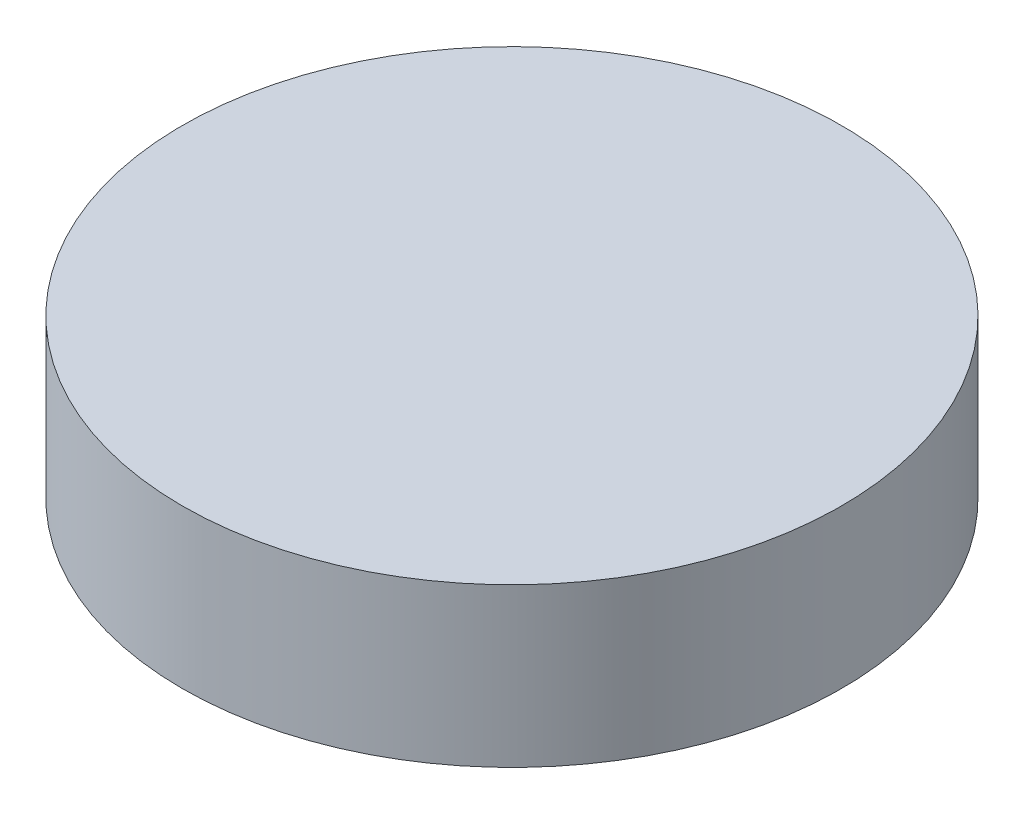
ISO-10303-21;
HEADER;
FILE_DESCRIPTION(('STEP AP214'),'2;1');
FILE_NAME('part.step','',(''),(''),'','','');
FILE_SCHEMA(('AUTOMOTIVE_DESIGN { 1 0 10303 214 1 1 1 1 }'));
ENDSEC;
DATA;
#1=APPLICATION_CONTEXT('core data for automotive mechanical design processes');
#2=APPLICATION_PROTOCOL_DEFINITION('international standard','automotive_design',2000,#1);
#3=PRODUCT_CONTEXT('',#1,'mechanical');
#4=PRODUCT('Part','Part','',(#3));
#5=PRODUCT_RELATED_PRODUCT_CATEGORY('part','',(#4));
#6=PRODUCT_DEFINITION_FORMATION('','',#4);
#7=PRODUCT_DEFINITION_CONTEXT('part definition',#1,'design');
#8=PRODUCT_DEFINITION('design','',#6,#7);
#9=PRODUCT_DEFINITION_SHAPE('','',#8);
#10=(LENGTH_UNIT() NAMED_UNIT(*) SI_UNIT(.MILLI.,.METRE.));
#11=(NAMED_UNIT(*) PLANE_ANGLE_UNIT() SI_UNIT($,.RADIAN.));
#12=(NAMED_UNIT(*) SI_UNIT($,.STERADIAN.) SOLID_ANGLE_UNIT());
#13=UNCERTAINTY_MEASURE_WITH_UNIT(LENGTH_MEASURE(1.E-05),#10,'distance_accuracy_value','');
#14=(GEOMETRIC_REPRESENTATION_CONTEXT(3) GLOBAL_UNCERTAINTY_ASSIGNED_CONTEXT((#13)) GLOBAL_UNIT_ASSIGNED_CONTEXT((#10,
#11,#12)) REPRESENTATION_CONTEXT('',''));
#15=CARTESIAN_POINT('',(0.,0.,0.));
#16=DIRECTION('',(0.,0.,1.));
#17=DIRECTION('',(1.,0.,0.));
#18=AXIS2_PLACEMENT_3D('',#15,#16,#17);
#19=CARTESIAN_POINT('',(650.,12.,-50.));
#20=DIRECTION('',(0.,-1.,0.));
#21=DIRECTION('',(0.,0.,-1.));
#22=AXIS2_PLACEMENT_3D('',#19,#20,#21);
#23=CYLINDRICAL_SURFACE('',#22,25.);
#24=CARTESIAN_POINT('',(650.,12.,-50.));
#25=DIRECTION('',(0.,1.,0.));
#26=DIRECTION('',(0.,0.,1.));
#27=AXIS2_PLACEMENT_3D('',#24,#25,#26);
#28=CIRCLE('',#27,25.);
#29=CARTESIAN_POINT('',(650.,12.,-25.));
#30=VERTEX_POINT('',#29);
#31=EDGE_CURVE('E10',#30,#30,#28,.T.);
#32=ORIENTED_EDGE('',*,*,#31,.F.);
#33=EDGE_LOOP('',(#32));
#34=FACE_BOUND('',#33,.T.);
#35=CARTESIAN_POINT('',(650.,0.,-50.));
#36=DIRECTION('',(0.,1.,0.));
#37=DIRECTION('',(0.,0.,1.));
#38=AXIS2_PLACEMENT_3D('',#35,#36,#37);
#39=CIRCLE('',#38,25.);
#40=CARTESIAN_POINT('',(650.,0.,-25.));
#41=VERTEX_POINT('',#40);
#42=EDGE_CURVE('E40',#41,#41,#39,.T.);
#43=ORIENTED_EDGE('',*,*,#42,.T.);
#44=EDGE_LOOP('',(#43));
#45=FACE_BOUND('',#44,.T.);
#46=ADVANCED_FACE('F37',(#34,#45),#23,.T.);
#47=CARTESIAN_POINT('',(650.,12.,-50.));
#48=DIRECTION('',(0.,1.,0.));
#49=DIRECTION('',(0.,0.,1.));
#50=AXIS2_PLACEMENT_3D('',#47,#48,#49);
#51=PLANE('',#50);
#52=ORIENTED_EDGE('',*,*,#31,.T.);
#53=EDGE_LOOP('',(#52));
#54=FACE_BOUND('',#53,.T.);
#55=ADVANCED_FACE('F52',(#54),#51,.T.);
#56=CARTESIAN_POINT('',(650.,0.,-50.));
#57=DIRECTION('',(0.,1.,0.));
#58=DIRECTION('',(0.,0.,1.));
#59=AXIS2_PLACEMENT_3D('',#56,#57,#58);
#60=PLANE('',#59);
#61=ORIENTED_EDGE('',*,*,#42,.F.);
#62=EDGE_LOOP('',(#61));
#63=FACE_BOUND('',#62,.T.);
#64=ADVANCED_FACE('F50',(#63),#60,.F.);
#65=CLOSED_SHELL('',(#46,#55,#64));
#66=MANIFOLD_SOLID_BREP('B2',#65);
#67=ADVANCED_BREP_SHAPE_REPRESENTATION('',(#18,#66),#14);
#68=SHAPE_DEFINITION_REPRESENTATION(#9,#67);
ENDSEC;
END-ISO-10303-21;
